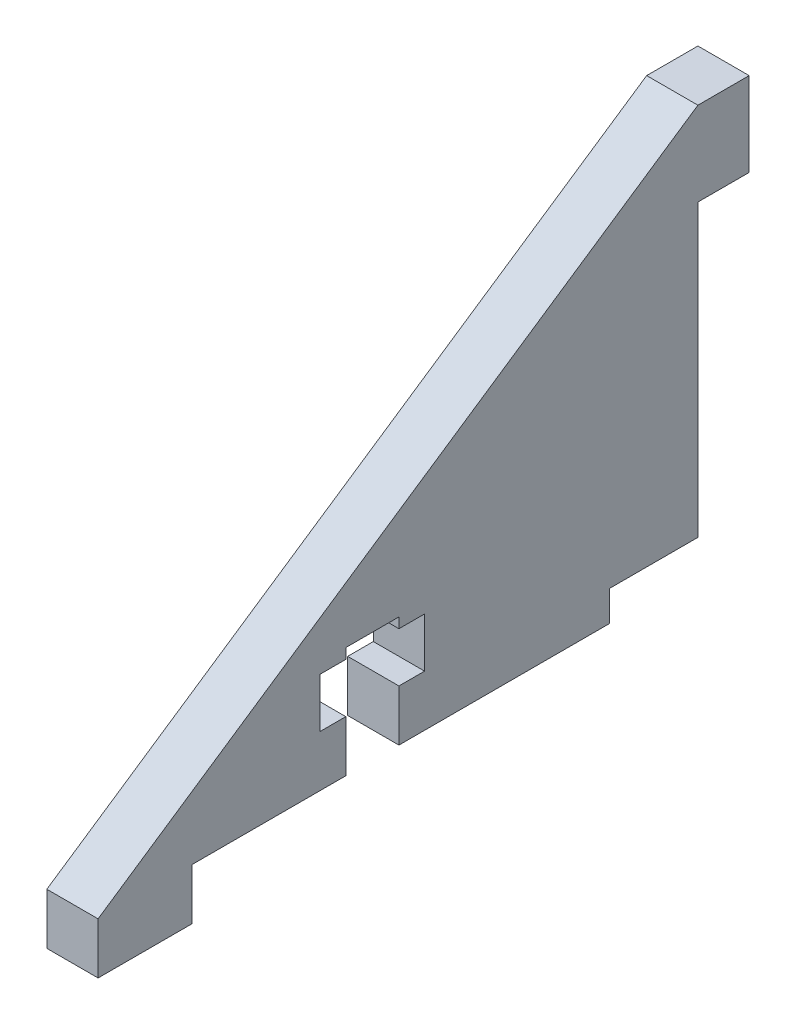
ISO-10303-21;
HEADER;
FILE_DESCRIPTION(('STEP AP214'),'2;1');
FILE_NAME('part.step','',(''),(''),'','','');
FILE_SCHEMA(('AUTOMOTIVE_DESIGN { 1 0 10303 214 1 1 1 1 }'));
ENDSEC;
DATA;
#1=APPLICATION_CONTEXT('core data for automotive mechanical design processes');
#2=APPLICATION_PROTOCOL_DEFINITION('international standard','automotive_design',2000,#1);
#3=PRODUCT_CONTEXT('',#1,'mechanical');
#4=PRODUCT('Part','Part','',(#3));
#5=PRODUCT_RELATED_PRODUCT_CATEGORY('part','',(#4));
#6=PRODUCT_DEFINITION_FORMATION('','',#4);
#7=PRODUCT_DEFINITION_CONTEXT('part definition',#1,'design');
#8=PRODUCT_DEFINITION('design','',#6,#7);
#9=PRODUCT_DEFINITION_SHAPE('','',#8);
#10=(LENGTH_UNIT() NAMED_UNIT(*) SI_UNIT(.MILLI.,.METRE.));
#11=(NAMED_UNIT(*) PLANE_ANGLE_UNIT() SI_UNIT($,.RADIAN.));
#12=(NAMED_UNIT(*) SI_UNIT($,.STERADIAN.) SOLID_ANGLE_UNIT());
#13=UNCERTAINTY_MEASURE_WITH_UNIT(LENGTH_MEASURE(1.E-05),#10,'distance_accuracy_value','');
#14=(GEOMETRIC_REPRESENTATION_CONTEXT(3) GLOBAL_UNCERTAINTY_ASSIGNED_CONTEXT((#13)) GLOBAL_UNIT_ASSIGNED_CONTEXT((#10,
#11,#12)) REPRESENTATION_CONTEXT('',''));
#15=CARTESIAN_POINT('',(0.,0.,0.));
#16=DIRECTION('',(0.,0.,1.));
#17=DIRECTION('',(1.,0.,0.));
#18=AXIS2_PLACEMENT_3D('',#15,#16,#17);
#19=CARTESIAN_POINT('',(3.,-3.,0.));
#20=DIRECTION('',(0.,0.,1.));
#21=DIRECTION('',(1.,0.,0.));
#22=AXIS2_PLACEMENT_3D('',#19,#20,#21);
#23=PLANE('',#22);
#24=DIRECTION('',(0.,1.,0.));
#25=VECTOR('',#24,1.);
#26=CARTESIAN_POINT('',(0.,-3.,0.));
#27=LINE('',#26,#25);
#28=CARTESIAN_POINT('',(0.,-3.,0.));
#29=VERTEX_POINT('',#28);
#30=CARTESIAN_POINT('',(0.,0.,0.));
#31=VERTEX_POINT('',#30);
#32=EDGE_CURVE('E225',#29,#31,#27,.T.);
#33=ORIENTED_EDGE('',*,*,#32,.T.);
#34=DIRECTION('',(-1.,0.,0.));
#35=VECTOR('',#34,1.);
#36=CARTESIAN_POINT('',(3.,0.,0.));
#37=LINE('',#36,#35);
#38=CARTESIAN_POINT('',(3.,0.,0.));
#39=VERTEX_POINT('',#38);
#40=EDGE_CURVE('E11',#39,#31,#37,.T.);
#41=ORIENTED_EDGE('',*,*,#40,.F.);
#42=DIRECTION('',(0.,1.,0.));
#43=VECTOR('',#42,1.);
#44=CARTESIAN_POINT('',(3.,-3.,0.));
#45=LINE('',#44,#43);
#46=CARTESIAN_POINT('',(3.,-3.,0.));
#47=VERTEX_POINT('',#46);
#48=EDGE_CURVE('E269',#47,#39,#45,.T.);
#49=ORIENTED_EDGE('',*,*,#48,.F.);
#50=DIRECTION('',(-1.,0.,0.));
#51=VECTOR('',#50,1.);
#52=CARTESIAN_POINT('',(3.,-3.,0.));
#53=LINE('',#52,#51);
#54=EDGE_CURVE('E221',#47,#29,#53,.T.);
#55=ORIENTED_EDGE('',*,*,#54,.T.);
#56=EDGE_LOOP('',(#33,#41,#49,#55));
#57=FACE_BOUND('',#56,.T.);
#58=ADVANCED_FACE('F39',(#57),#23,.F.);
#59=CARTESIAN_POINT('',(3.,0.,0.));
#60=DIRECTION('',(0.,1.,0.));
#61=DIRECTION('',(0.,0.,1.));
#62=AXIS2_PLACEMENT_3D('',#59,#60,#61);
#63=PLANE('',#62);
#64=DIRECTION('',(0.,0.,-1.));
#65=VECTOR('',#64,1.);
#66=CARTESIAN_POINT('',(0.,0.,0.));
#67=LINE('',#66,#65);
#68=CARTESIAN_POINT('',(0.,0.,-9.));
#69=VERTEX_POINT('',#68);
#70=EDGE_CURVE('E228',#31,#69,#67,.T.);
#71=ORIENTED_EDGE('',*,*,#70,.T.);
#72=DIRECTION('',(-1.,0.,0.));
#73=VECTOR('',#72,1.);
#74=CARTESIAN_POINT('',(3.,0.,-9.));
#75=LINE('',#74,#73);
#76=CARTESIAN_POINT('',(3.,0.,-9.));
#77=VERTEX_POINT('',#76);
#78=EDGE_CURVE('E47',#77,#69,#75,.T.);
#79=ORIENTED_EDGE('',*,*,#78,.F.);
#80=DIRECTION('',(0.,0.,-1.));
#81=VECTOR('',#80,1.);
#82=CARTESIAN_POINT('',(3.,0.,0.));
#83=LINE('',#82,#81);
#84=EDGE_CURVE('E143',#39,#77,#83,.T.);
#85=ORIENTED_EDGE('',*,*,#84,.F.);
#86=ORIENTED_EDGE('',*,*,#40,.T.);
#87=EDGE_LOOP('',(#71,#79,#85,#86));
#88=FACE_BOUND('',#87,.T.);
#89=ADVANCED_FACE('F402',(#88),#63,.F.);
#90=CARTESIAN_POINT('',(3.,0.,-9.));
#91=DIRECTION('',(0.,0.,1.));
#92=DIRECTION('',(0.,-1.,0.));
#93=AXIS2_PLACEMENT_3D('',#90,#91,#92);
#94=PLANE('',#93);
#95=DIRECTION('',(0.,1.,0.));
#96=VECTOR('',#95,1.);
#97=CARTESIAN_POINT('',(0.,0.,-9.));
#98=LINE('',#97,#96);
#99=CARTESIAN_POINT('',(0.,3.,-9.));
#100=VERTEX_POINT('',#99);
#101=EDGE_CURVE('E230',#69,#100,#98,.T.);
#102=ORIENTED_EDGE('',*,*,#101,.T.);
#103=DIRECTION('',(-1.,0.,0.));
#104=VECTOR('',#103,1.);
#105=CARTESIAN_POINT('',(3.,3.,-9.));
#106=LINE('',#105,#104);
#107=CARTESIAN_POINT('',(3.,3.,-9.));
#108=VERTEX_POINT('',#107);
#109=EDGE_CURVE('E321',#108,#100,#106,.T.);
#110=ORIENTED_EDGE('',*,*,#109,.F.);
#111=DIRECTION('',(0.,1.,0.));
#112=VECTOR('',#111,1.);
#113=CARTESIAN_POINT('',(3.,0.,-9.));
#114=LINE('',#113,#112);
#115=EDGE_CURVE('E329',#77,#108,#114,.T.);
#116=ORIENTED_EDGE('',*,*,#115,.F.);
#117=ORIENTED_EDGE('',*,*,#78,.T.);
#118=EDGE_LOOP('',(#102,#110,#116,#117));
#119=FACE_BOUND('',#118,.T.);
#120=ADVANCED_FACE('F327',(#119),#94,.F.);
#121=CARTESIAN_POINT('',(3.,3.,-9.));
#122=DIRECTION('',(0.,-1.,0.));
#123=DIRECTION('',(0.,0.,-1.));
#124=AXIS2_PLACEMENT_3D('',#121,#122,#123);
#125=PLANE('',#124);
#126=DIRECTION('',(0.,0.,1.));
#127=VECTOR('',#126,1.);
#128=CARTESIAN_POINT('',(0.,3.,-9.));
#129=LINE('',#128,#127);
#130=CARTESIAN_POINT('',(0.,3.,-7.5));
#131=VERTEX_POINT('',#130);
#132=EDGE_CURVE('E232',#100,#131,#129,.T.);
#133=ORIENTED_EDGE('',*,*,#132,.T.);
#134=DIRECTION('',(-1.,0.,0.));
#135=VECTOR('',#134,1.);
#136=CARTESIAN_POINT('',(3.,3.,-7.5));
#137=LINE('',#136,#135);
#138=CARTESIAN_POINT('',(3.,3.,-7.5));
#139=VERTEX_POINT('',#138);
#140=EDGE_CURVE('E318',#139,#131,#137,.T.);
#141=ORIENTED_EDGE('',*,*,#140,.F.);
#142=DIRECTION('',(0.,0.,1.));
#143=VECTOR('',#142,1.);
#144=CARTESIAN_POINT('',(3.,3.,-9.));
#145=LINE('',#144,#143);
#146=EDGE_CURVE('E347',#108,#139,#145,.T.);
#147=ORIENTED_EDGE('',*,*,#146,.F.);
#148=ORIENTED_EDGE('',*,*,#109,.T.);
#149=EDGE_LOOP('',(#133,#141,#147,#148));
#150=FACE_BOUND('',#149,.T.);
#151=ADVANCED_FACE('F338',(#150),#125,.F.);
#152=CARTESIAN_POINT('',(3.,3.,-7.5));
#153=DIRECTION('',(0.,0.,1.));
#154=DIRECTION('',(1.,0.,0.));
#155=AXIS2_PLACEMENT_3D('',#152,#153,#154);
#156=PLANE('',#155);
#157=DIRECTION('',(0.,1.,0.));
#158=VECTOR('',#157,1.);
#159=CARTESIAN_POINT('',(0.,3.,-7.5));
#160=LINE('',#159,#158);
#161=CARTESIAN_POINT('',(0.,5.9,-7.5));
#162=VERTEX_POINT('',#161);
#163=EDGE_CURVE('E234',#131,#162,#160,.T.);
#164=ORIENTED_EDGE('',*,*,#163,.T.);
#165=DIRECTION('',(-1.,0.,0.));
#166=VECTOR('',#165,1.);
#167=CARTESIAN_POINT('',(3.,5.9,-7.5));
#168=LINE('',#167,#166);
#169=CARTESIAN_POINT('',(3.,5.9,-7.5));
#170=VERTEX_POINT('',#169);
#171=EDGE_CURVE('E315',#170,#162,#168,.T.);
#172=ORIENTED_EDGE('',*,*,#171,.F.);
#173=DIRECTION('',(0.,1.,0.));
#174=VECTOR('',#173,1.);
#175=CARTESIAN_POINT('',(3.,3.,-7.5));
#176=LINE('',#175,#174);
#177=EDGE_CURVE('E344',#139,#170,#176,.T.);
#178=ORIENTED_EDGE('',*,*,#177,.F.);
#179=ORIENTED_EDGE('',*,*,#140,.T.);
#180=EDGE_LOOP('',(#164,#172,#178,#179));
#181=FACE_BOUND('',#180,.T.);
#182=ADVANCED_FACE('F342',(#181),#156,.F.);
#183=CARTESIAN_POINT('',(3.,5.9,-7.5));
#184=DIRECTION('',(0.,1.,0.));
#185=DIRECTION('',(0.,0.,1.));
#186=AXIS2_PLACEMENT_3D('',#183,#184,#185);
#187=PLANE('',#186);
#188=DIRECTION('',(0.,0.,-1.));
#189=VECTOR('',#188,1.);
#190=CARTESIAN_POINT('',(0.,5.9,-7.5));
#191=LINE('',#190,#189);
#192=CARTESIAN_POINT('',(0.,5.9,-9.));
#193=VERTEX_POINT('',#192);
#194=EDGE_CURVE('E236',#162,#193,#191,.T.);
#195=ORIENTED_EDGE('',*,*,#194,.T.);
#196=DIRECTION('',(-1.,0.,0.));
#197=VECTOR('',#196,1.);
#198=CARTESIAN_POINT('',(3.,5.9,-9.));
#199=LINE('',#198,#197);
#200=CARTESIAN_POINT('',(3.,5.9,-9.));
#201=VERTEX_POINT('',#200);
#202=EDGE_CURVE('E312',#201,#193,#199,.T.);
#203=ORIENTED_EDGE('',*,*,#202,.F.);
#204=DIRECTION('',(0.,0.,-1.));
#205=VECTOR('',#204,1.);
#206=CARTESIAN_POINT('',(3.,5.9,-7.5));
#207=LINE('',#206,#205);
#208=EDGE_CURVE('E346',#170,#201,#207,.T.);
#209=ORIENTED_EDGE('',*,*,#208,.F.);
#210=ORIENTED_EDGE('',*,*,#171,.T.);
#211=EDGE_LOOP('',(#195,#203,#209,#210));
#212=FACE_BOUND('',#211,.T.);
#213=ADVANCED_FACE('F415',(#212),#187,.F.);
#214=CARTESIAN_POINT('',(3.,5.9,-9.));
#215=DIRECTION('',(0.,0.,1.));
#216=DIRECTION('',(1.,0.,0.));
#217=AXIS2_PLACEMENT_3D('',#214,#215,#216);
#218=PLANE('',#217);
#219=DIRECTION('',(0.,1.,0.));
#220=VECTOR('',#219,1.);
#221=CARTESIAN_POINT('',(0.,5.9,-9.));
#222=LINE('',#221,#220);
#223=CARTESIAN_POINT('',(0.,6.5,-9.));
#224=VERTEX_POINT('',#223);
#225=EDGE_CURVE('E238',#193,#224,#222,.T.);
#226=ORIENTED_EDGE('',*,*,#225,.T.);
#227=DIRECTION('',(-1.,0.,0.));
#228=VECTOR('',#227,1.);
#229=CARTESIAN_POINT('',(3.,6.5,-9.));
#230=LINE('',#229,#228);
#231=CARTESIAN_POINT('',(3.,6.5,-9.));
#232=VERTEX_POINT('',#231);
#233=EDGE_CURVE('E309',#232,#224,#230,.T.);
#234=ORIENTED_EDGE('',*,*,#233,.F.);
#235=DIRECTION('',(0.,1.,0.));
#236=VECTOR('',#235,1.);
#237=CARTESIAN_POINT('',(3.,5.9,-9.));
#238=LINE('',#237,#236);
#239=EDGE_CURVE('E349',#201,#232,#238,.T.);
#240=ORIENTED_EDGE('',*,*,#239,.F.);
#241=ORIENTED_EDGE('',*,*,#202,.T.);
#242=EDGE_LOOP('',(#226,#234,#240,#241));
#243=FACE_BOUND('',#242,.T.);
#244=ADVANCED_FACE('F418',(#243),#218,.F.);
#245=CARTESIAN_POINT('',(3.,6.5,-12.11));
#246=DIRECTION('',(0.,1.,0.));
#247=DIRECTION('',(0.,0.,1.));
#248=AXIS2_PLACEMENT_3D('',#245,#246,#247);
#249=PLANE('',#248);
#250=DIRECTION('',(0.,0.,-1.));
#251=VECTOR('',#250,1.);
#252=CARTESIAN_POINT('',(0.,6.5,-12.11));
#253=LINE('',#252,#251);
#254=CARTESIAN_POINT('',(0.,6.5,-12.11));
#255=VERTEX_POINT('',#254);
#256=EDGE_CURVE('E240',#224,#255,#253,.T.);
#257=ORIENTED_EDGE('',*,*,#256,.T.);
#258=DIRECTION('',(-1.,0.,0.));
#259=VECTOR('',#258,1.);
#260=CARTESIAN_POINT('',(3.,6.5,-12.11));
#261=LINE('',#260,#259);
#262=CARTESIAN_POINT('',(3.,6.5,-12.11));
#263=VERTEX_POINT('',#262);
#264=EDGE_CURVE('E306',#263,#255,#261,.T.);
#265=ORIENTED_EDGE('',*,*,#264,.F.);
#266=DIRECTION('',(0.,0.,-1.));
#267=VECTOR('',#266,1.);
#268=CARTESIAN_POINT('',(3.,6.5,-12.11));
#269=LINE('',#268,#267);
#270=EDGE_CURVE('E355',#232,#263,#269,.T.);
#271=ORIENTED_EDGE('',*,*,#270,.F.);
#272=ORIENTED_EDGE('',*,*,#233,.T.);
#273=EDGE_LOOP('',(#257,#265,#271,#272));
#274=FACE_BOUND('',#273,.T.);
#275=ADVANCED_FACE('F422',(#274),#249,.F.);
#276=CARTESIAN_POINT('',(3.,5.9,-12.11));
#277=DIRECTION('',(0.,0.,-1.));
#278=DIRECTION('',(-1.,0.,0.));
#279=AXIS2_PLACEMENT_3D('',#276,#277,#278);
#280=PLANE('',#279);
#281=DIRECTION('',(0.,-1.,0.));
#282=VECTOR('',#281,1.);
#283=CARTESIAN_POINT('',(0.,5.9,-12.11));
#284=LINE('',#283,#282);
#285=CARTESIAN_POINT('',(0.,5.9,-12.11));
#286=VERTEX_POINT('',#285);
#287=EDGE_CURVE('E242',#255,#286,#284,.T.);
#288=ORIENTED_EDGE('',*,*,#287,.T.);
#289=DIRECTION('',(-1.,0.,0.));
#290=VECTOR('',#289,1.);
#291=CARTESIAN_POINT('',(3.,5.9,-12.11));
#292=LINE('',#291,#290);
#293=CARTESIAN_POINT('',(3.,5.9,-12.11));
#294=VERTEX_POINT('',#293);
#295=EDGE_CURVE('E303',#294,#286,#292,.T.);
#296=ORIENTED_EDGE('',*,*,#295,.F.);
#297=DIRECTION('',(0.,-1.,0.));
#298=VECTOR('',#297,1.);
#299=CARTESIAN_POINT('',(3.,5.9,-12.11));
#300=LINE('',#299,#298);
#301=EDGE_CURVE('E357',#263,#294,#300,.T.);
#302=ORIENTED_EDGE('',*,*,#301,.F.);
#303=ORIENTED_EDGE('',*,*,#264,.T.);
#304=EDGE_LOOP('',(#288,#296,#302,#303));
#305=FACE_BOUND('',#304,.T.);
#306=ADVANCED_FACE('F426',(#305),#280,.F.);
#307=CARTESIAN_POINT('',(3.,5.9,-13.61));
#308=DIRECTION('',(0.,1.,0.));
#309=DIRECTION('',(0.,0.,1.));
#310=AXIS2_PLACEMENT_3D('',#307,#308,#309);
#311=PLANE('',#310);
#312=DIRECTION('',(0.,0.,-1.));
#313=VECTOR('',#312,1.);
#314=CARTESIAN_POINT('',(0.,5.9,-13.61));
#315=LINE('',#314,#313);
#316=CARTESIAN_POINT('',(0.,5.9,-13.61));
#317=VERTEX_POINT('',#316);
#318=EDGE_CURVE('E244',#286,#317,#315,.T.);
#319=ORIENTED_EDGE('',*,*,#318,.T.);
#320=DIRECTION('',(-1.,0.,0.));
#321=VECTOR('',#320,1.);
#322=CARTESIAN_POINT('',(3.,5.9,-13.61));
#323=LINE('',#322,#321);
#324=CARTESIAN_POINT('',(3.,5.9,-13.61));
#325=VERTEX_POINT('',#324);
#326=EDGE_CURVE('E300',#325,#317,#323,.T.);
#327=ORIENTED_EDGE('',*,*,#326,.F.);
#328=DIRECTION('',(0.,0.,-1.));
#329=VECTOR('',#328,1.);
#330=CARTESIAN_POINT('',(3.,5.9,-13.61));
#331=LINE('',#330,#329);
#332=EDGE_CURVE('E359',#294,#325,#331,.T.);
#333=ORIENTED_EDGE('',*,*,#332,.F.);
#334=ORIENTED_EDGE('',*,*,#295,.T.);
#335=EDGE_LOOP('',(#319,#327,#333,#334));
#336=FACE_BOUND('',#335,.T.);
#337=ADVANCED_FACE('F430',(#336),#311,.F.);
#338=CARTESIAN_POINT('',(3.,3.,-13.61));
#339=DIRECTION('',(0.,0.,-1.));
#340=DIRECTION('',(-1.,0.,0.));
#341=AXIS2_PLACEMENT_3D('',#338,#339,#340);
#342=PLANE('',#341);
#343=DIRECTION('',(0.,-1.,0.));
#344=VECTOR('',#343,1.);
#345=CARTESIAN_POINT('',(0.,3.,-13.61));
#346=LINE('',#345,#344);
#347=CARTESIAN_POINT('',(0.,3.,-13.61));
#348=VERTEX_POINT('',#347);
#349=EDGE_CURVE('E246',#317,#348,#346,.T.);
#350=ORIENTED_EDGE('',*,*,#349,.T.);
#351=DIRECTION('',(-1.,0.,0.));
#352=VECTOR('',#351,1.);
#353=CARTESIAN_POINT('',(3.,3.,-13.61));
#354=LINE('',#353,#352);
#355=CARTESIAN_POINT('',(3.,3.,-13.61));
#356=VERTEX_POINT('',#355);
#357=EDGE_CURVE('E297',#356,#348,#354,.T.);
#358=ORIENTED_EDGE('',*,*,#357,.F.);
#359=DIRECTION('',(0.,-1.,0.));
#360=VECTOR('',#359,1.);
#361=CARTESIAN_POINT('',(3.,3.,-13.61));
#362=LINE('',#361,#360);
#363=EDGE_CURVE('E361',#325,#356,#362,.T.);
#364=ORIENTED_EDGE('',*,*,#363,.F.);
#365=ORIENTED_EDGE('',*,*,#326,.T.);
#366=EDGE_LOOP('',(#350,#358,#364,#365));
#367=FACE_BOUND('',#366,.T.);
#368=ADVANCED_FACE('F434',(#367),#342,.F.);
#369=CARTESIAN_POINT('',(3.,3.,-12.11));
#370=DIRECTION('',(0.,-1.,0.));
#371=DIRECTION('',(0.,0.,-1.));
#372=AXIS2_PLACEMENT_3D('',#369,#370,#371);
#373=PLANE('',#372);
#374=DIRECTION('',(0.,0.,1.));
#375=VECTOR('',#374,1.);
#376=CARTESIAN_POINT('',(0.,3.,-12.11));
#377=LINE('',#376,#375);
#378=CARTESIAN_POINT('',(0.,3.,-12.11));
#379=VERTEX_POINT('',#378);
#380=EDGE_CURVE('E248',#348,#379,#377,.T.);
#381=ORIENTED_EDGE('',*,*,#380,.T.);
#382=DIRECTION('',(-1.,0.,0.));
#383=VECTOR('',#382,1.);
#384=CARTESIAN_POINT('',(3.,3.,-12.11));
#385=LINE('',#384,#383);
#386=CARTESIAN_POINT('',(3.,3.,-12.11));
#387=VERTEX_POINT('',#386);
#388=EDGE_CURVE('E294',#387,#379,#385,.T.);
#389=ORIENTED_EDGE('',*,*,#388,.F.);
#390=DIRECTION('',(0.,0.,1.));
#391=VECTOR('',#390,1.);
#392=CARTESIAN_POINT('',(3.,3.,-12.11));
#393=LINE('',#392,#391);
#394=EDGE_CURVE('E363',#356,#387,#393,.T.);
#395=ORIENTED_EDGE('',*,*,#394,.F.);
#396=ORIENTED_EDGE('',*,*,#357,.T.);
#397=EDGE_LOOP('',(#381,#389,#395,#396));
#398=FACE_BOUND('',#397,.T.);
#399=ADVANCED_FACE('F438',(#398),#373,.F.);
#400=CARTESIAN_POINT('',(3.,0.,-12.11));
#401=DIRECTION('',(0.,0.,-1.));
#402=DIRECTION('',(-1.,0.,0.));
#403=AXIS2_PLACEMENT_3D('',#400,#401,#402);
#404=PLANE('',#403);
#405=DIRECTION('',(0.,-1.,0.));
#406=VECTOR('',#405,1.);
#407=CARTESIAN_POINT('',(0.,0.,-12.11));
#408=LINE('',#407,#406);
#409=CARTESIAN_POINT('',(0.,0.,-12.11));
#410=VERTEX_POINT('',#409);
#411=EDGE_CURVE('E250',#379,#410,#408,.T.);
#412=ORIENTED_EDGE('',*,*,#411,.T.);
#413=DIRECTION('',(-1.,0.,0.));
#414=VECTOR('',#413,1.);
#415=CARTESIAN_POINT('',(3.,0.,-12.11));
#416=LINE('',#415,#414);
#417=CARTESIAN_POINT('',(3.,0.,-12.11));
#418=VERTEX_POINT('',#417);
#419=EDGE_CURVE('E291',#418,#410,#416,.T.);
#420=ORIENTED_EDGE('',*,*,#419,.F.);
#421=DIRECTION('',(0.,-1.,0.));
#422=VECTOR('',#421,1.);
#423=CARTESIAN_POINT('',(3.,0.,-12.11));
#424=LINE('',#423,#422);
#425=EDGE_CURVE('E365',#387,#418,#424,.T.);
#426=ORIENTED_EDGE('',*,*,#425,.F.);
#427=ORIENTED_EDGE('',*,*,#388,.T.);
#428=EDGE_LOOP('',(#412,#420,#426,#427));
#429=FACE_BOUND('',#428,.T.);
#430=ADVANCED_FACE('F442',(#429),#404,.F.);
#431=CARTESIAN_POINT('',(3.,0.,-12.11));
#432=DIRECTION('',(0.,1.,0.));
#433=DIRECTION('',(0.,0.,1.));
#434=AXIS2_PLACEMENT_3D('',#431,#432,#433);
#435=PLANE('',#434);
#436=DIRECTION('',(0.,0.,-1.));
#437=VECTOR('',#436,1.);
#438=CARTESIAN_POINT('',(0.,0.,-12.11));
#439=LINE('',#438,#437);
#440=CARTESIAN_POINT('',(0.,0.,-24.44));
#441=VERTEX_POINT('',#440);
#442=EDGE_CURVE('E252',#410,#441,#439,.T.);
#443=ORIENTED_EDGE('',*,*,#442,.T.);
#444=DIRECTION('',(-1.,0.,0.));
#445=VECTOR('',#444,1.);
#446=CARTESIAN_POINT('',(3.,0.,-24.44));
#447=LINE('',#446,#445);
#448=CARTESIAN_POINT('',(3.,0.,-24.44));
#449=VERTEX_POINT('',#448);
#450=EDGE_CURVE('E288',#449,#441,#447,.T.);
#451=ORIENTED_EDGE('',*,*,#450,.F.);
#452=DIRECTION('',(0.,0.,-1.));
#453=VECTOR('',#452,1.);
#454=CARTESIAN_POINT('',(3.,0.,-12.11));
#455=LINE('',#454,#453);
#456=EDGE_CURVE('E367',#418,#449,#455,.T.);
#457=ORIENTED_EDGE('',*,*,#456,.F.);
#458=ORIENTED_EDGE('',*,*,#419,.T.);
#459=EDGE_LOOP('',(#443,#451,#457,#458));
#460=FACE_BOUND('',#459,.T.);
#461=ADVANCED_FACE('F446',(#460),#435,.F.);
#462=CARTESIAN_POINT('',(3.,0.,-24.44));
#463=DIRECTION('',(0.,0.,1.));
#464=DIRECTION('',(1.,0.,0.));
#465=AXIS2_PLACEMENT_3D('',#462,#463,#464);
#466=PLANE('',#465);
#467=DIRECTION('',(0.,1.,0.));
#468=VECTOR('',#467,1.);
#469=CARTESIAN_POINT('',(0.,0.,-24.44));
#470=LINE('',#469,#468);
#471=CARTESIAN_POINT('',(0.,1.78,-24.44));
#472=VERTEX_POINT('',#471);
#473=EDGE_CURVE('E254',#441,#472,#470,.T.);
#474=ORIENTED_EDGE('',*,*,#473,.T.);
#475=DIRECTION('',(-1.,0.,0.));
#476=VECTOR('',#475,1.);
#477=CARTESIAN_POINT('',(3.,1.78,-24.44));
#478=LINE('',#477,#476);
#479=CARTESIAN_POINT('',(3.,1.78,-24.44));
#480=VERTEX_POINT('',#479);
#481=EDGE_CURVE('E285',#480,#472,#478,.T.);
#482=ORIENTED_EDGE('',*,*,#481,.F.);
#483=DIRECTION('',(0.,1.,0.));
#484=VECTOR('',#483,1.);
#485=CARTESIAN_POINT('',(3.,0.,-24.44));
#486=LINE('',#485,#484);
#487=EDGE_CURVE('E369',#449,#480,#486,.T.);
#488=ORIENTED_EDGE('',*,*,#487,.F.);
#489=ORIENTED_EDGE('',*,*,#450,.T.);
#490=EDGE_LOOP('',(#474,#482,#488,#489));
#491=FACE_BOUND('',#490,.T.);
#492=ADVANCED_FACE('F450',(#491),#466,.F.);
#493=CARTESIAN_POINT('',(3.,1.78,-24.44));
#494=DIRECTION('',(0.,1.,0.));
#495=DIRECTION('',(0.,0.,1.));
#496=AXIS2_PLACEMENT_3D('',#493,#494,#495);
#497=PLANE('',#496);
#498=DIRECTION('',(0.,0.,-1.));
#499=VECTOR('',#498,1.);
#500=CARTESIAN_POINT('',(0.,1.78,-24.44));
#501=LINE('',#500,#499);
#502=CARTESIAN_POINT('',(0.,1.78,-29.61));
#503=VERTEX_POINT('',#502);
#504=EDGE_CURVE('E256',#472,#503,#501,.T.);
#505=ORIENTED_EDGE('',*,*,#504,.T.);
#506=DIRECTION('',(-1.,0.,0.));
#507=VECTOR('',#506,1.);
#508=CARTESIAN_POINT('',(3.,1.78,-29.61));
#509=LINE('',#508,#507);
#510=CARTESIAN_POINT('',(3.,1.78,-29.61));
#511=VERTEX_POINT('',#510);
#512=EDGE_CURVE('E282',#511,#503,#509,.T.);
#513=ORIENTED_EDGE('',*,*,#512,.F.);
#514=DIRECTION('',(0.,0.,-1.));
#515=VECTOR('',#514,1.);
#516=CARTESIAN_POINT('',(3.,1.78,-24.44));
#517=LINE('',#516,#515);
#518=EDGE_CURVE('E371',#480,#511,#517,.T.);
#519=ORIENTED_EDGE('',*,*,#518,.F.);
#520=ORIENTED_EDGE('',*,*,#481,.T.);
#521=EDGE_LOOP('',(#505,#513,#519,#520));
#522=FACE_BOUND('',#521,.T.);
#523=ADVANCED_FACE('F454',(#522),#497,.F.);
#524=CARTESIAN_POINT('',(3.,1.78,-29.61));
#525=DIRECTION('',(0.,0.,1.));
#526=DIRECTION('',(1.,0.,0.));
#527=AXIS2_PLACEMENT_3D('',#524,#525,#526);
#528=PLANE('',#527);
#529=DIRECTION('',(0.,1.,0.));
#530=VECTOR('',#529,1.);
#531=CARTESIAN_POINT('',(0.,1.78,-29.61));
#532=LINE('',#531,#530);
#533=CARTESIAN_POINT('',(0.,18.78,-29.61));
#534=VERTEX_POINT('',#533);
#535=EDGE_CURVE('E258',#503,#534,#532,.T.);
#536=ORIENTED_EDGE('',*,*,#535,.T.);
#537=DIRECTION('',(-1.,0.,0.));
#538=VECTOR('',#537,1.);
#539=CARTESIAN_POINT('',(3.,18.78,-29.61));
#540=LINE('',#539,#538);
#541=CARTESIAN_POINT('',(3.,18.78,-29.61));
#542=VERTEX_POINT('',#541);
#543=EDGE_CURVE('E279',#542,#534,#540,.T.);
#544=ORIENTED_EDGE('',*,*,#543,.F.);
#545=DIRECTION('',(0.,1.,0.));
#546=VECTOR('',#545,1.);
#547=CARTESIAN_POINT('',(3.,1.78,-29.61));
#548=LINE('',#547,#546);
#549=EDGE_CURVE('E373',#511,#542,#548,.T.);
#550=ORIENTED_EDGE('',*,*,#549,.F.);
#551=ORIENTED_EDGE('',*,*,#512,.T.);
#552=EDGE_LOOP('',(#536,#544,#550,#551));
#553=FACE_BOUND('',#552,.T.);
#554=ADVANCED_FACE('F458',(#553),#528,.F.);
#555=CARTESIAN_POINT('',(3.,18.78,-29.61));
#556=DIRECTION('',(0.,1.,0.));
#557=DIRECTION('',(0.,0.,1.));
#558=AXIS2_PLACEMENT_3D('',#555,#556,#557);
#559=PLANE('',#558);
#560=DIRECTION('',(0.,0.,-1.));
#561=VECTOR('',#560,1.);
#562=CARTESIAN_POINT('',(0.,18.78,-29.61));
#563=LINE('',#562,#561);
#564=CARTESIAN_POINT('',(0.,18.78,-32.61));
#565=VERTEX_POINT('',#564);
#566=EDGE_CURVE('E260',#534,#565,#563,.T.);
#567=ORIENTED_EDGE('',*,*,#566,.T.);
#568=DIRECTION('',(-1.,0.,0.));
#569=VECTOR('',#568,1.);
#570=CARTESIAN_POINT('',(3.,18.78,-32.61));
#571=LINE('',#570,#569);
#572=CARTESIAN_POINT('',(3.,18.78,-32.61));
#573=VERTEX_POINT('',#572);
#574=EDGE_CURVE('E276',#573,#565,#571,.T.);
#575=ORIENTED_EDGE('',*,*,#574,.F.);
#576=DIRECTION('',(0.,0.,-1.));
#577=VECTOR('',#576,1.);
#578=CARTESIAN_POINT('',(3.,18.78,-29.61));
#579=LINE('',#578,#577);
#580=EDGE_CURVE('E375',#542,#573,#579,.T.);
#581=ORIENTED_EDGE('',*,*,#580,.F.);
#582=ORIENTED_EDGE('',*,*,#543,.T.);
#583=EDGE_LOOP('',(#567,#575,#581,#582));
#584=FACE_BOUND('',#583,.T.);
#585=ADVANCED_FACE('F462',(#584),#559,.F.);
#586=CARTESIAN_POINT('',(3.,18.78,-32.61));
#587=DIRECTION('',(0.,0.,1.));
#588=DIRECTION('',(1.,0.,0.));
#589=AXIS2_PLACEMENT_3D('',#586,#587,#588);
#590=PLANE('',#589);
#591=DIRECTION('',(0.,1.,0.));
#592=VECTOR('',#591,1.);
#593=CARTESIAN_POINT('',(0.,18.78,-32.61));
#594=LINE('',#593,#592);
#595=CARTESIAN_POINT('',(0.,23.69,-32.61));
#596=VERTEX_POINT('',#595);
#597=EDGE_CURVE('E262',#565,#596,#594,.T.);
#598=ORIENTED_EDGE('',*,*,#597,.T.);
#599=DIRECTION('',(-1.,0.,0.));
#600=VECTOR('',#599,1.);
#601=CARTESIAN_POINT('',(3.,23.69,-32.61));
#602=LINE('',#601,#600);
#603=CARTESIAN_POINT('',(3.,23.69,-32.61));
#604=VERTEX_POINT('',#603);
#605=EDGE_CURVE('E273',#604,#596,#602,.T.);
#606=ORIENTED_EDGE('',*,*,#605,.F.);
#607=DIRECTION('',(0.,1.,0.));
#608=VECTOR('',#607,1.);
#609=CARTESIAN_POINT('',(3.,18.78,-32.61));
#610=LINE('',#609,#608);
#611=EDGE_CURVE('E377',#573,#604,#610,.T.);
#612=ORIENTED_EDGE('',*,*,#611,.F.);
#613=ORIENTED_EDGE('',*,*,#574,.T.);
#614=EDGE_LOOP('',(#598,#606,#612,#613));
#615=FACE_BOUND('',#614,.T.);
#616=ADVANCED_FACE('F383',(#615),#590,.F.);
#617=CARTESIAN_POINT('',(3.,23.69,-32.61));
#618=DIRECTION('',(0.,-1.,0.));
#619=DIRECTION('',(0.,0.,-1.));
#620=AXIS2_PLACEMENT_3D('',#617,#618,#619);
#621=PLANE('',#620);
#622=DIRECTION('',(0.,0.,1.));
#623=VECTOR('',#622,1.);
#624=CARTESIAN_POINT('',(0.,23.69,-32.61));
#625=LINE('',#624,#623);
#626=CARTESIAN_POINT('',(0.,23.69,-29.61));
#627=VERTEX_POINT('',#626);
#628=EDGE_CURVE('E264',#596,#627,#625,.T.);
#629=ORIENTED_EDGE('',*,*,#628,.T.);
#630=DIRECTION('',(-1.,0.,0.));
#631=VECTOR('',#630,1.);
#632=CARTESIAN_POINT('',(3.,23.69,-29.61));
#633=LINE('',#632,#631);
#634=CARTESIAN_POINT('',(3.,23.69,-29.61));
#635=VERTEX_POINT('',#634);
#636=EDGE_CURVE('E216',#635,#627,#633,.T.);
#637=ORIENTED_EDGE('',*,*,#636,.F.);
#638=DIRECTION('',(0.,0.,1.));
#639=VECTOR('',#638,1.);
#640=CARTESIAN_POINT('',(3.,23.69,-32.61));
#641=LINE('',#640,#639);
#642=EDGE_CURVE('E207',#604,#635,#641,.T.);
#643=ORIENTED_EDGE('',*,*,#642,.F.);
#644=ORIENTED_EDGE('',*,*,#605,.T.);
#645=EDGE_LOOP('',(#629,#637,#643,#644));
#646=FACE_BOUND('',#645,.T.);
#647=ADVANCED_FACE('F387',(#646),#621,.F.);
#648=CARTESIAN_POINT('',(3.,23.69,-29.61));
#649=DIRECTION('',(0.,-0.828949933448881,-0.559322811831501));
#650=DIRECTION('',(0.,0.559322811831501,-0.828949933448881));
#651=AXIS2_PLACEMENT_3D('',#648,#649,#650);
#652=PLANE('',#651);
#653=DIRECTION('',(0.,-0.559322811831501,0.828949933448881));
#654=VECTOR('',#653,1.);
#655=CARTESIAN_POINT('',(0.,23.69,-29.61));
#656=LINE('',#655,#654);
#657=CARTESIAN_POINT('',(0.,0.,5.5));
#658=VERTEX_POINT('',#657);
#659=EDGE_CURVE('E215',#627,#658,#656,.T.);
#660=ORIENTED_EDGE('',*,*,#659,.T.);
#661=DIRECTION('',(-1.,0.,0.));
#662=VECTOR('',#661,1.);
#663=CARTESIAN_POINT('',(3.,0.,5.5));
#664=LINE('',#663,#662);
#665=CARTESIAN_POINT('',(3.,0.,5.5));
#666=VERTEX_POINT('',#665);
#667=EDGE_CURVE('E212',#666,#658,#664,.T.);
#668=ORIENTED_EDGE('',*,*,#667,.F.);
#669=DIRECTION('',(0.,-0.559322811831501,0.828949933448881));
#670=VECTOR('',#669,1.);
#671=CARTESIAN_POINT('',(3.,23.69,-29.61));
#672=LINE('',#671,#670);
#673=EDGE_CURVE('E201',#635,#666,#672,.T.);
#674=ORIENTED_EDGE('',*,*,#673,.F.);
#675=ORIENTED_EDGE('',*,*,#636,.T.);
#676=EDGE_LOOP('',(#660,#668,#674,#675));
#677=FACE_BOUND('',#676,.T.);
#678=ADVANCED_FACE('F213',(#677),#652,.F.);
#679=CARTESIAN_POINT('',(3.,0.,5.5));
#680=DIRECTION('',(0.,0.,-1.));
#681=DIRECTION('',(-1.,0.,0.));
#682=AXIS2_PLACEMENT_3D('',#679,#680,#681);
#683=PLANE('',#682);
#684=DIRECTION('',(0.,-1.,0.));
#685=VECTOR('',#684,1.);
#686=CARTESIAN_POINT('',(0.,0.,5.5));
#687=LINE('',#686,#685);
#688=CARTESIAN_POINT('',(0.,-3.,5.5));
#689=VERTEX_POINT('',#688);
#690=EDGE_CURVE('E129',#658,#689,#687,.T.);
#691=ORIENTED_EDGE('',*,*,#690,.T.);
#692=DIRECTION('',(-1.,0.,0.));
#693=VECTOR('',#692,1.);
#694=CARTESIAN_POINT('',(3.,-3.,5.5));
#695=LINE('',#694,#693);
#696=CARTESIAN_POINT('',(3.,-3.,5.5));
#697=VERTEX_POINT('',#696);
#698=EDGE_CURVE('E217',#697,#689,#695,.T.);
#699=ORIENTED_EDGE('',*,*,#698,.F.);
#700=DIRECTION('',(0.,-1.,0.));
#701=VECTOR('',#700,1.);
#702=CARTESIAN_POINT('',(3.,0.,5.5));
#703=LINE('',#702,#701);
#704=EDGE_CURVE('E205',#666,#697,#703,.T.);
#705=ORIENTED_EDGE('',*,*,#704,.F.);
#706=ORIENTED_EDGE('',*,*,#667,.T.);
#707=EDGE_LOOP('',(#691,#699,#705,#706));
#708=FACE_BOUND('',#707,.T.);
#709=ADVANCED_FACE('F219',(#708),#683,.F.);
#710=CARTESIAN_POINT('',(3.,-3.,5.5));
#711=DIRECTION('',(0.,1.,0.));
#712=DIRECTION('',(0.,0.,1.));
#713=AXIS2_PLACEMENT_3D('',#710,#711,#712);
#714=PLANE('',#713);
#715=DIRECTION('',(0.,0.,-1.));
#716=VECTOR('',#715,1.);
#717=CARTESIAN_POINT('',(0.,-3.,5.5));
#718=LINE('',#717,#716);
#719=EDGE_CURVE('E135',#689,#29,#718,.T.);
#720=ORIENTED_EDGE('',*,*,#719,.T.);
#721=ORIENTED_EDGE('',*,*,#54,.F.);
#722=DIRECTION('',(0.,0.,-1.));
#723=VECTOR('',#722,1.);
#724=CARTESIAN_POINT('',(3.,-3.,5.5));
#725=LINE('',#724,#723);
#726=EDGE_CURVE('E55',#697,#47,#725,.T.);
#727=ORIENTED_EDGE('',*,*,#726,.F.);
#728=ORIENTED_EDGE('',*,*,#698,.T.);
#729=EDGE_LOOP('',(#720,#721,#727,#728));
#730=FACE_BOUND('',#729,.T.);
#731=ADVANCED_FACE('F391',(#730),#714,.F.);
#732=CARTESIAN_POINT('',(3.,0.,0.));
#733=DIRECTION('',(-1.,0.,0.));
#734=DIRECTION('',(0.,0.,1.));
#735=AXIS2_PLACEMENT_3D('',#732,#733,#734);
#736=PLANE('',#735);
#737=ORIENTED_EDGE('',*,*,#48,.T.);
#738=ORIENTED_EDGE('',*,*,#84,.T.);
#739=ORIENTED_EDGE('',*,*,#115,.T.);
#740=ORIENTED_EDGE('',*,*,#146,.T.);
#741=ORIENTED_EDGE('',*,*,#177,.T.);
#742=ORIENTED_EDGE('',*,*,#208,.T.);
#743=ORIENTED_EDGE('',*,*,#239,.T.);
#744=ORIENTED_EDGE('',*,*,#270,.T.);
#745=ORIENTED_EDGE('',*,*,#301,.T.);
#746=ORIENTED_EDGE('',*,*,#332,.T.);
#747=ORIENTED_EDGE('',*,*,#363,.T.);
#748=ORIENTED_EDGE('',*,*,#394,.T.);
#749=ORIENTED_EDGE('',*,*,#425,.T.);
#750=ORIENTED_EDGE('',*,*,#456,.T.);
#751=ORIENTED_EDGE('',*,*,#487,.T.);
#752=ORIENTED_EDGE('',*,*,#518,.T.);
#753=ORIENTED_EDGE('',*,*,#549,.T.);
#754=ORIENTED_EDGE('',*,*,#580,.T.);
#755=ORIENTED_EDGE('',*,*,#611,.T.);
#756=ORIENTED_EDGE('',*,*,#642,.T.);
#757=ORIENTED_EDGE('',*,*,#673,.T.);
#758=ORIENTED_EDGE('',*,*,#704,.T.);
#759=ORIENTED_EDGE('',*,*,#726,.T.);
#760=EDGE_LOOP('',(#737,#738,#739,#740,#741,#742,#743,#744,#745,#746,#747,#748,#749,#750,#751,
#752,#753,#754,#755,#756,#757,#758,#759));
#761=FACE_BOUND('',#760,.T.);
#762=ADVANCED_FACE('F203',(#761),#736,.F.);
#763=CARTESIAN_POINT('',(0.,0.,0.));
#764=DIRECTION('',(-1.,0.,0.));
#765=DIRECTION('',(0.,0.,1.));
#766=AXIS2_PLACEMENT_3D('',#763,#764,#765);
#767=PLANE('',#766);
#768=ORIENTED_EDGE('',*,*,#32,.F.);
#769=ORIENTED_EDGE('',*,*,#719,.F.);
#770=ORIENTED_EDGE('',*,*,#690,.F.);
#771=ORIENTED_EDGE('',*,*,#659,.F.);
#772=ORIENTED_EDGE('',*,*,#628,.F.);
#773=ORIENTED_EDGE('',*,*,#597,.F.);
#774=ORIENTED_EDGE('',*,*,#566,.F.);
#775=ORIENTED_EDGE('',*,*,#535,.F.);
#776=ORIENTED_EDGE('',*,*,#504,.F.);
#777=ORIENTED_EDGE('',*,*,#473,.F.);
#778=ORIENTED_EDGE('',*,*,#442,.F.);
#779=ORIENTED_EDGE('',*,*,#411,.F.);
#780=ORIENTED_EDGE('',*,*,#380,.F.);
#781=ORIENTED_EDGE('',*,*,#349,.F.);
#782=ORIENTED_EDGE('',*,*,#318,.F.);
#783=ORIENTED_EDGE('',*,*,#287,.F.);
#784=ORIENTED_EDGE('',*,*,#256,.F.);
#785=ORIENTED_EDGE('',*,*,#225,.F.);
#786=ORIENTED_EDGE('',*,*,#194,.F.);
#787=ORIENTED_EDGE('',*,*,#163,.F.);
#788=ORIENTED_EDGE('',*,*,#132,.F.);
#789=ORIENTED_EDGE('',*,*,#101,.F.);
#790=ORIENTED_EDGE('',*,*,#70,.F.);
#791=EDGE_LOOP('',(#768,#769,#770,#771,#772,#773,#774,#775,#776,#777,#778,#779,#780,#781,#782,
#783,#784,#785,#786,#787,#788,#789,#790));
#792=FACE_BOUND('',#791,.T.);
#793=ADVANCED_FACE('F333',(#792),#767,.T.);
#794=CLOSED_SHELL('',(#58,#89,#120,#151,#182,#213,#244,#275,#306,#337,#368,#399,#430,#461,#492,
#523,#554,#585,#616,#647,#678,#709,#731,#762,#793));
#795=MANIFOLD_SOLID_BREP('B2',#794);
#796=ADVANCED_BREP_SHAPE_REPRESENTATION('',(#18,#795),#14);
#797=SHAPE_DEFINITION_REPRESENTATION(#9,#796);
ENDSEC;
END-ISO-10303-21;
